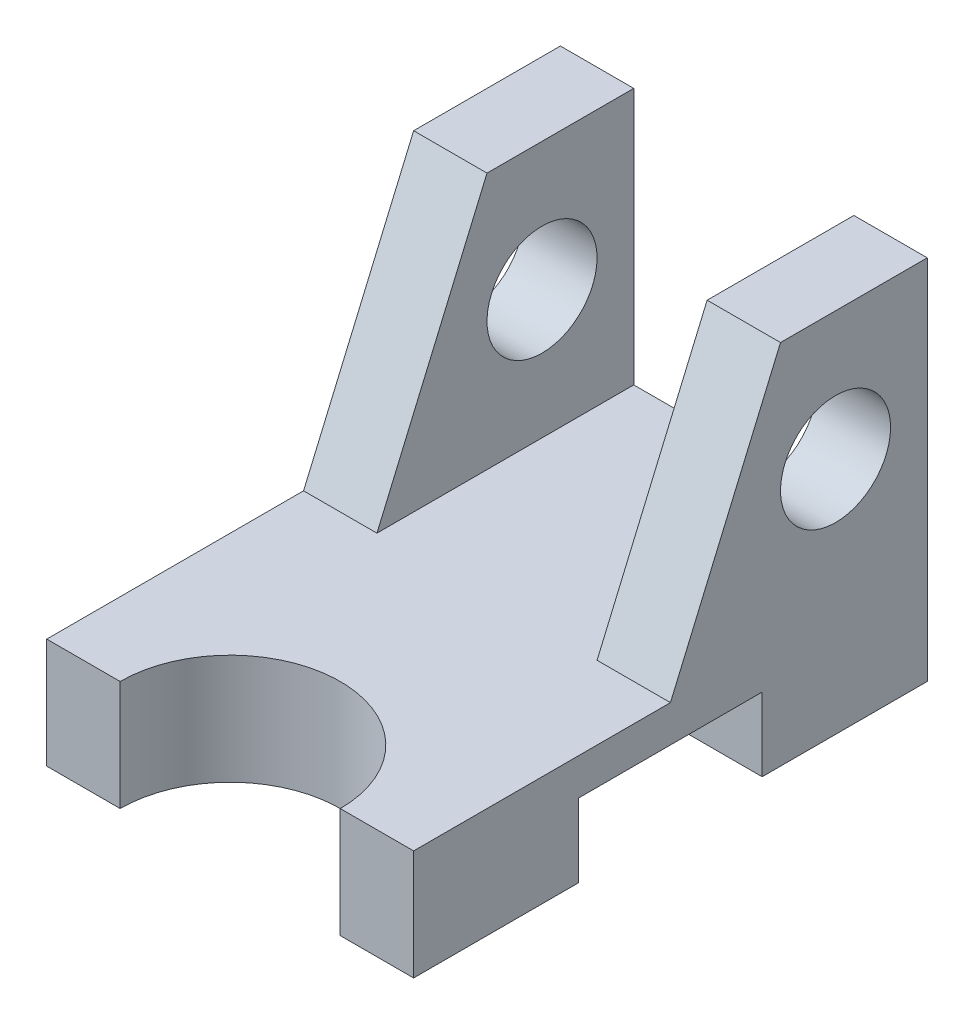
ISO-10303-21;
HEADER;
FILE_DESCRIPTION(('STEP AP214'),'2;1');
FILE_NAME('part.step','',(''),(''),'','','');
FILE_SCHEMA(('AUTOMOTIVE_DESIGN { 1 0 10303 214 1 1 1 1 }'));
ENDSEC;
DATA;
#1=APPLICATION_CONTEXT('core data for automotive mechanical design processes');
#2=APPLICATION_PROTOCOL_DEFINITION('international standard','automotive_design',2000,#1);
#3=PRODUCT_CONTEXT('',#1,'mechanical');
#4=PRODUCT('Part','Part','',(#3));
#5=PRODUCT_RELATED_PRODUCT_CATEGORY('part','',(#4));
#6=PRODUCT_DEFINITION_FORMATION('','',#4);
#7=PRODUCT_DEFINITION_CONTEXT('part definition',#1,'design');
#8=PRODUCT_DEFINITION('design','',#6,#7);
#9=PRODUCT_DEFINITION_SHAPE('','',#8);
#10=(LENGTH_UNIT() NAMED_UNIT(*) SI_UNIT(.MILLI.,.METRE.));
#11=(NAMED_UNIT(*) PLANE_ANGLE_UNIT() SI_UNIT($,.RADIAN.));
#12=(NAMED_UNIT(*) SI_UNIT($,.STERADIAN.) SOLID_ANGLE_UNIT());
#13=UNCERTAINTY_MEASURE_WITH_UNIT(LENGTH_MEASURE(1.E-05),#10,'distance_accuracy_value','');
#14=(GEOMETRIC_REPRESENTATION_CONTEXT(3) GLOBAL_UNCERTAINTY_ASSIGNED_CONTEXT((#13)) GLOBAL_UNIT_ASSIGNED_CONTEXT((#10,
#11,#12)) REPRESENTATION_CONTEXT('',''));
#15=CARTESIAN_POINT('',(0.,0.,0.));
#16=DIRECTION('',(0.,0.,1.));
#17=DIRECTION('',(1.,0.,0.));
#18=AXIS2_PLACEMENT_3D('',#15,#16,#17);
#19=CARTESIAN_POINT('',(-50.,100.,-30.));
#20=DIRECTION('',(0.,0.393919298579168,0.919145030018058));
#21=DIRECTION('',(0.,-0.919145030018058,0.393919298579168));
#22=AXIS2_PLACEMENT_3D('',#19,#20,#21);
#23=PLANE('',#22);
#24=DIRECTION('',(0.,0.919145030018058,-0.393919298579168));
#25=VECTOR('',#24,1.);
#26=CARTESIAN_POINT('',(30.,100.,-30.));
#27=LINE('',#26,#25);
#28=CARTESIAN_POINT('',(30.,30.,0.));
#29=VERTEX_POINT('',#28);
#30=CARTESIAN_POINT('',(30.,100.,-30.));
#31=VERTEX_POINT('',#30);
#32=EDGE_CURVE('E200',#29,#31,#27,.T.);
#33=ORIENTED_EDGE('',*,*,#32,.F.);
#34=DIRECTION('',(1.,0.,0.));
#35=VECTOR('',#34,1.);
#36=CARTESIAN_POINT('',(-50.,30.,0.));
#37=LINE('',#36,#35);
#38=CARTESIAN_POINT('',(50.,30.,0.));
#39=VERTEX_POINT('',#38);
#40=EDGE_CURVE('E305',#29,#39,#37,.T.);
#41=ORIENTED_EDGE('',*,*,#40,.T.);
#42=DIRECTION('',(0.,-0.919145030018058,0.393919298579168));
#43=VECTOR('',#42,1.);
#44=CARTESIAN_POINT('',(50.,100.,-30.));
#45=LINE('',#44,#43);
#46=CARTESIAN_POINT('',(50.,100.,-30.));
#47=VERTEX_POINT('',#46);
#48=EDGE_CURVE('E254',#47,#39,#45,.T.);
#49=ORIENTED_EDGE('',*,*,#48,.F.);
#50=DIRECTION('',(1.,0.,0.));
#51=VECTOR('',#50,1.);
#52=CARTESIAN_POINT('',(-50.,100.,-30.));
#53=LINE('',#52,#51);
#54=EDGE_CURVE('E310',#31,#47,#53,.T.);
#55=ORIENTED_EDGE('',*,*,#54,.F.);
#56=EDGE_LOOP('',(#33,#41,#49,#55));
#57=FACE_BOUND('',#56,.T.);
#58=ADVANCED_FACE('F45',(#57),#23,.T.);
#59=CARTESIAN_POINT('',(-50.,100.,-70.));
#60=DIRECTION('',(0.,1.,0.));
#61=DIRECTION('',(0.,0.,1.));
#62=AXIS2_PLACEMENT_3D('',#59,#60,#61);
#63=PLANE('',#62);
#64=DIRECTION('',(0.,0.,-1.));
#65=VECTOR('',#64,1.);
#66=CARTESIAN_POINT('',(30.,100.,70.));
#67=LINE('',#66,#65);
#68=CARTESIAN_POINT('',(30.,100.,-70.));
#69=VERTEX_POINT('',#68);
#70=EDGE_CURVE('E192',#31,#69,#67,.T.);
#71=ORIENTED_EDGE('',*,*,#70,.F.);
#72=ORIENTED_EDGE('',*,*,#54,.T.);
#73=DIRECTION('',(0.,0.,1.));
#74=VECTOR('',#73,1.);
#75=CARTESIAN_POINT('',(50.,100.,-70.));
#76=LINE('',#75,#74);
#77=CARTESIAN_POINT('',(50.,100.,-70.));
#78=VERTEX_POINT('',#77);
#79=EDGE_CURVE('E250',#78,#47,#76,.T.);
#80=ORIENTED_EDGE('',*,*,#79,.F.);
#81=DIRECTION('',(1.,0.,0.));
#82=VECTOR('',#81,1.);
#83=CARTESIAN_POINT('',(-50.,100.,-70.));
#84=LINE('',#83,#82);
#85=EDGE_CURVE('E313',#69,#78,#84,.T.);
#86=ORIENTED_EDGE('',*,*,#85,.F.);
#87=EDGE_LOOP('',(#71,#72,#80,#86));
#88=FACE_BOUND('',#87,.T.);
#89=ADVANCED_FACE('F346',(#88),#63,.T.);
#90=CARTESIAN_POINT('',(50.,65.,-45.));
#91=DIRECTION('',(1.,0.,0.));
#92=DIRECTION('',(0.,0.,-1.));
#93=AXIS2_PLACEMENT_3D('',#90,#91,#92);
#94=CYLINDRICAL_SURFACE('',#93,15.);
#95=CARTESIAN_POINT('',(30.,65.,-45.));
#96=DIRECTION('',(1.,0.,0.));
#97=DIRECTION('',(0.,1.,0.));
#98=AXIS2_PLACEMENT_3D('',#95,#96,#97);
#99=CIRCLE('',#98,15.);
#100=CARTESIAN_POINT('',(30.,80.,-45.));
#101=VERTEX_POINT('',#100);
#102=EDGE_CURVE('E49',#101,#101,#99,.F.);
#103=ORIENTED_EDGE('',*,*,#102,.T.);
#104=EDGE_LOOP('',(#103));
#105=FACE_BOUND('',#104,.T.);
#106=CARTESIAN_POINT('',(50.,65.,-45.));
#107=DIRECTION('',(1.,0.,0.));
#108=DIRECTION('',(0.,0.,-1.));
#109=AXIS2_PLACEMENT_3D('',#106,#107,#108);
#110=CIRCLE('',#109,15.);
#111=CARTESIAN_POINT('',(50.,65.,-60.));
#112=VERTEX_POINT('',#111);
#113=EDGE_CURVE('E203',#112,#112,#110,.T.);
#114=ORIENTED_EDGE('',*,*,#113,.T.);
#115=EDGE_LOOP('',(#114));
#116=FACE_BOUND('',#115,.T.);
#117=ADVANCED_FACE('F354',(#105,#116),#94,.F.);
#118=CARTESIAN_POINT('',(-50.,30.,70.));
#119=DIRECTION('',(0.,0.,1.));
#120=DIRECTION('',(1.,0.,0.));
#121=AXIS2_PLACEMENT_3D('',#118,#119,#120);
#122=PLANE('',#121);
#123=DIRECTION('',(0.,1.,0.));
#124=VECTOR('',#123,1.);
#125=CARTESIAN_POINT('',(30.,0.,70.));
#126=LINE('',#125,#124);
#127=CARTESIAN_POINT('',(30.,0.,70.));
#128=VERTEX_POINT('',#127);
#129=CARTESIAN_POINT('',(30.,30.,70.));
#130=VERTEX_POINT('',#129);
#131=EDGE_CURVE('E217',#128,#130,#126,.T.);
#132=ORIENTED_EDGE('',*,*,#131,.F.);
#133=DIRECTION('',(1.,0.,0.));
#134=VECTOR('',#133,1.);
#135=CARTESIAN_POINT('',(-50.,0.,70.));
#136=LINE('',#135,#134);
#137=CARTESIAN_POINT('',(50.,0.,70.));
#138=VERTEX_POINT('',#137);
#139=EDGE_CURVE('E300',#128,#138,#136,.T.);
#140=ORIENTED_EDGE('',*,*,#139,.T.);
#141=DIRECTION('',(0.,-1.,0.));
#142=VECTOR('',#141,1.);
#143=CARTESIAN_POINT('',(50.,30.,70.));
#144=LINE('',#143,#142);
#145=CARTESIAN_POINT('',(50.,30.,70.));
#146=VERTEX_POINT('',#145);
#147=EDGE_CURVE('E220',#146,#138,#144,.T.);
#148=ORIENTED_EDGE('',*,*,#147,.F.);
#149=DIRECTION('',(1.,0.,0.));
#150=VECTOR('',#149,1.);
#151=CARTESIAN_POINT('',(-50.,30.,70.));
#152=LINE('',#151,#150);
#153=EDGE_CURVE('E55',#130,#146,#152,.T.);
#154=ORIENTED_EDGE('',*,*,#153,.F.);
#155=EDGE_LOOP('',(#132,#140,#148,#154));
#156=FACE_BOUND('',#155,.T.);
#157=ADVANCED_FACE('F406',(#156),#122,.T.);
#158=DIRECTION('',(0.,1.,0.));
#159=VECTOR('',#158,1.);
#160=CARTESIAN_POINT('',(-30.,0.,70.));
#161=LINE('',#160,#159);
#162=CARTESIAN_POINT('',(-30.,0.,70.));
#163=VERTEX_POINT('',#162);
#164=CARTESIAN_POINT('',(-30.,30.,70.));
#165=VERTEX_POINT('',#164);
#166=EDGE_CURVE('E71',#163,#165,#161,.T.);
#167=ORIENTED_EDGE('',*,*,#166,.T.);
#168=CARTESIAN_POINT('',(-50.,30.,70.));
#169=VERTEX_POINT('',#168);
#170=EDGE_CURVE('E11',#169,#165,#152,.T.);
#171=ORIENTED_EDGE('',*,*,#170,.F.);
#172=DIRECTION('',(0.,-1.,0.));
#173=VECTOR('',#172,1.);
#174=CARTESIAN_POINT('',(-50.,30.,70.));
#175=LINE('',#174,#173);
#176=CARTESIAN_POINT('',(-50.,0.,70.));
#177=VERTEX_POINT('',#176);
#178=EDGE_CURVE('E262',#169,#177,#175,.T.);
#179=ORIENTED_EDGE('',*,*,#178,.T.);
#180=EDGE_CURVE('E329',#177,#163,#136,.T.);
#181=ORIENTED_EDGE('',*,*,#180,.T.);
#182=EDGE_LOOP('',(#167,#171,#179,#181));
#183=FACE_BOUND('',#182,.T.);
#184=ADVANCED_FACE('F47',(#183),#122,.T.);
#185=CARTESIAN_POINT('',(-50.,30.,0.));
#186=DIRECTION('',(0.,1.,0.));
#187=DIRECTION('',(0.,0.,1.));
#188=AXIS2_PLACEMENT_3D('',#185,#186,#187);
#189=PLANE('',#188);
#190=ORIENTED_EDGE('',*,*,#170,.T.);
#191=CARTESIAN_POINT('',(0.,30.,70.));
#192=DIRECTION('',(0.,1.,0.));
#193=DIRECTION('',(0.,0.,-1.));
#194=AXIS2_PLACEMENT_3D('',#191,#192,#193);
#195=CIRCLE('',#194,30.);
#196=EDGE_CURVE('E211',#130,#165,#195,.T.);
#197=ORIENTED_EDGE('',*,*,#196,.F.);
#198=ORIENTED_EDGE('',*,*,#153,.T.);
#199=DIRECTION('',(0.,0.,1.));
#200=VECTOR('',#199,1.);
#201=CARTESIAN_POINT('',(50.,30.,0.));
#202=LINE('',#201,#200);
#203=EDGE_CURVE('E258',#39,#146,#202,.T.);
#204=ORIENTED_EDGE('',*,*,#203,.F.);
#205=ORIENTED_EDGE('',*,*,#40,.F.);
#206=DIRECTION('',(0.,0.,-1.));
#207=VECTOR('',#206,1.);
#208=CARTESIAN_POINT('',(30.,30.,70.));
#209=LINE('',#208,#207);
#210=CARTESIAN_POINT('',(30.,30.,-70.));
#211=VERTEX_POINT('',#210);
#212=EDGE_CURVE('E173',#29,#211,#209,.T.);
#213=ORIENTED_EDGE('',*,*,#212,.T.);
#214=DIRECTION('',(-1.,0.,0.));
#215=VECTOR('',#214,1.);
#216=CARTESIAN_POINT('',(30.,30.,-70.));
#217=LINE('',#216,#215);
#218=CARTESIAN_POINT('',(-30.,30.,-70.));
#219=VERTEX_POINT('',#218);
#220=EDGE_CURVE('E176',#211,#219,#217,.T.);
#221=ORIENTED_EDGE('',*,*,#220,.T.);
#222=DIRECTION('',(0.,0.,-1.));
#223=VECTOR('',#222,1.);
#224=CARTESIAN_POINT('',(-30.,30.,70.));
#225=LINE('',#224,#223);
#226=CARTESIAN_POINT('',(-30.,30.,0.));
#227=VERTEX_POINT('',#226);
#228=EDGE_CURVE('E160',#227,#219,#225,.T.);
#229=ORIENTED_EDGE('',*,*,#228,.F.);
#230=CARTESIAN_POINT('',(-50.,30.,0.));
#231=VERTEX_POINT('',#230);
#232=EDGE_CURVE('E302',#231,#227,#37,.T.);
#233=ORIENTED_EDGE('',*,*,#232,.F.);
#234=DIRECTION('',(0.,0.,1.));
#235=VECTOR('',#234,1.);
#236=CARTESIAN_POINT('',(-50.,30.,0.));
#237=LINE('',#236,#235);
#238=EDGE_CURVE('E297',#231,#169,#237,.T.);
#239=ORIENTED_EDGE('',*,*,#238,.T.);
#240=EDGE_LOOP('',(#190,#197,#198,#204,#205,#213,#221,#229,#233,#239));
#241=FACE_BOUND('',#240,.T.);
#242=ADVANCED_FACE('F177',(#241),#189,.T.);
#243=DIRECTION('',(0.,-0.919145030018058,0.393919298579168));
#244=VECTOR('',#243,1.);
#245=CARTESIAN_POINT('',(-30.,100.,-30.));
#246=LINE('',#245,#244);
#247=CARTESIAN_POINT('',(-30.,100.,-30.));
#248=VERTEX_POINT('',#247);
#249=EDGE_CURVE('E168',#248,#227,#246,.T.);
#250=ORIENTED_EDGE('',*,*,#249,.F.);
#251=CARTESIAN_POINT('',(-50.,100.,-30.));
#252=VERTEX_POINT('',#251);
#253=EDGE_CURVE('E306',#252,#248,#53,.T.);
#254=ORIENTED_EDGE('',*,*,#253,.F.);
#255=DIRECTION('',(0.,-0.919145030018058,0.393919298579168));
#256=VECTOR('',#255,1.);
#257=CARTESIAN_POINT('',(-50.,100.,-30.));
#258=LINE('',#257,#256);
#259=EDGE_CURVE('E293',#252,#231,#258,.T.);
#260=ORIENTED_EDGE('',*,*,#259,.T.);
#261=ORIENTED_EDGE('',*,*,#232,.T.);
#262=EDGE_LOOP('',(#250,#254,#260,#261));
#263=FACE_BOUND('',#262,.T.);
#264=ADVANCED_FACE('F349',(#263),#23,.T.);
#265=DIRECTION('',(0.,0.,-1.));
#266=VECTOR('',#265,1.);
#267=CARTESIAN_POINT('',(-30.,100.,70.));
#268=LINE('',#267,#266);
#269=CARTESIAN_POINT('',(-30.,100.,-70.));
#270=VERTEX_POINT('',#269);
#271=EDGE_CURVE('E172',#248,#270,#268,.T.);
#272=ORIENTED_EDGE('',*,*,#271,.T.);
#273=CARTESIAN_POINT('',(-50.,100.,-70.));
#274=VERTEX_POINT('',#273);
#275=EDGE_CURVE('E185',#274,#270,#84,.T.);
#276=ORIENTED_EDGE('',*,*,#275,.F.);
#277=DIRECTION('',(0.,0.,1.));
#278=VECTOR('',#277,1.);
#279=CARTESIAN_POINT('',(-50.,100.,-70.));
#280=LINE('',#279,#278);
#281=EDGE_CURVE('E289',#274,#252,#280,.T.);
#282=ORIENTED_EDGE('',*,*,#281,.T.);
#283=ORIENTED_EDGE('',*,*,#253,.T.);
#284=EDGE_LOOP('',(#272,#276,#282,#283));
#285=FACE_BOUND('',#284,.T.);
#286=ADVANCED_FACE('F357',(#285),#63,.T.);
#287=CARTESIAN_POINT('',(-50.,0.,-70.));
#288=DIRECTION('',(0.,0.,-1.));
#289=DIRECTION('',(-1.,0.,0.));
#290=AXIS2_PLACEMENT_3D('',#287,#288,#289);
#291=PLANE('',#290);
#292=DIRECTION('',(0.,-1.,0.));
#293=VECTOR('',#292,1.);
#294=CARTESIAN_POINT('',(30.,100.,-70.));
#295=LINE('',#294,#293);
#296=EDGE_CURVE('E63',#69,#211,#295,.T.);
#297=ORIENTED_EDGE('',*,*,#296,.F.);
#298=ORIENTED_EDGE('',*,*,#85,.T.);
#299=DIRECTION('',(0.,1.,0.));
#300=VECTOR('',#299,1.);
#301=CARTESIAN_POINT('',(50.,0.,-70.));
#302=LINE('',#301,#300);
#303=CARTESIAN_POINT('',(50.,0.,-70.));
#304=VERTEX_POINT('',#303);
#305=EDGE_CURVE('E246',#304,#78,#302,.T.);
#306=ORIENTED_EDGE('',*,*,#305,.F.);
#307=DIRECTION('',(1.,0.,0.));
#308=VECTOR('',#307,1.);
#309=CARTESIAN_POINT('',(-50.,0.,-70.));
#310=LINE('',#309,#308);
#311=CARTESIAN_POINT('',(-50.,0.,-70.));
#312=VERTEX_POINT('',#311);
#313=EDGE_CURVE('E314',#312,#304,#310,.T.);
#314=ORIENTED_EDGE('',*,*,#313,.F.);
#315=DIRECTION('',(0.,1.,0.));
#316=VECTOR('',#315,1.);
#317=CARTESIAN_POINT('',(-50.,0.,-70.));
#318=LINE('',#317,#316);
#319=EDGE_CURVE('E286',#312,#274,#318,.T.);
#320=ORIENTED_EDGE('',*,*,#319,.T.);
#321=ORIENTED_EDGE('',*,*,#275,.T.);
#322=DIRECTION('',(0.,1.,0.));
#323=VECTOR('',#322,1.);
#324=CARTESIAN_POINT('',(-30.,100.,-70.));
#325=LINE('',#324,#323);
#326=EDGE_CURVE('E165',#219,#270,#325,.T.);
#327=ORIENTED_EDGE('',*,*,#326,.F.);
#328=ORIENTED_EDGE('',*,*,#220,.F.);
#329=EDGE_LOOP('',(#297,#298,#306,#314,#320,#321,#327,#328));
#330=FACE_BOUND('',#329,.T.);
#331=ADVANCED_FACE('F183',(#330),#291,.T.);
#332=CARTESIAN_POINT('',(-50.,0.,-25.));
#333=DIRECTION('',(0.,-1.,0.));
#334=DIRECTION('',(0.,0.,-1.));
#335=AXIS2_PLACEMENT_3D('',#332,#333,#334);
#336=PLANE('',#335);
#337=ORIENTED_EDGE('',*,*,#313,.T.);
#338=DIRECTION('',(0.,0.,-1.));
#339=VECTOR('',#338,1.);
#340=CARTESIAN_POINT('',(50.,0.,-25.));
#341=LINE('',#340,#339);
#342=CARTESIAN_POINT('',(50.,0.,-25.));
#343=VERTEX_POINT('',#342);
#344=EDGE_CURVE('E242',#343,#304,#341,.T.);
#345=ORIENTED_EDGE('',*,*,#344,.F.);
#346=DIRECTION('',(1.,0.,0.));
#347=VECTOR('',#346,1.);
#348=CARTESIAN_POINT('',(-50.,0.,-25.));
#349=LINE('',#348,#347);
#350=CARTESIAN_POINT('',(-50.,0.,-25.));
#351=VERTEX_POINT('',#350);
#352=EDGE_CURVE('E317',#351,#343,#349,.T.);
#353=ORIENTED_EDGE('',*,*,#352,.F.);
#354=DIRECTION('',(0.,0.,-1.));
#355=VECTOR('',#354,1.);
#356=CARTESIAN_POINT('',(-50.,0.,-25.));
#357=LINE('',#356,#355);
#358=EDGE_CURVE('E282',#351,#312,#357,.T.);
#359=ORIENTED_EDGE('',*,*,#358,.T.);
#360=EDGE_LOOP('',(#337,#345,#353,#359));
#361=FACE_BOUND('',#360,.T.);
#362=ADVANCED_FACE('F378',(#361),#336,.T.);
#363=CARTESIAN_POINT('',(-50.,20.,-25.));
#364=DIRECTION('',(0.,0.,1.));
#365=DIRECTION('',(0.,-1.,0.));
#366=AXIS2_PLACEMENT_3D('',#363,#364,#365);
#367=PLANE('',#366);
#368=ORIENTED_EDGE('',*,*,#352,.T.);
#369=DIRECTION('',(0.,-1.,0.));
#370=VECTOR('',#369,1.);
#371=CARTESIAN_POINT('',(50.,20.,-25.));
#372=LINE('',#371,#370);
#373=CARTESIAN_POINT('',(50.,20.,-25.));
#374=VERTEX_POINT('',#373);
#375=EDGE_CURVE('E238',#374,#343,#372,.T.);
#376=ORIENTED_EDGE('',*,*,#375,.F.);
#377=DIRECTION('',(1.,0.,0.));
#378=VECTOR('',#377,1.);
#379=CARTESIAN_POINT('',(-50.,20.,-25.));
#380=LINE('',#379,#378);
#381=CARTESIAN_POINT('',(-50.,20.,-25.));
#382=VERTEX_POINT('',#381);
#383=EDGE_CURVE('E320',#382,#374,#380,.T.);
#384=ORIENTED_EDGE('',*,*,#383,.F.);
#385=DIRECTION('',(0.,-1.,0.));
#386=VECTOR('',#385,1.);
#387=CARTESIAN_POINT('',(-50.,20.,-25.));
#388=LINE('',#387,#386);
#389=EDGE_CURVE('E278',#382,#351,#388,.T.);
#390=ORIENTED_EDGE('',*,*,#389,.T.);
#391=EDGE_LOOP('',(#368,#376,#384,#390));
#392=FACE_BOUND('',#391,.T.);
#393=ADVANCED_FACE('F385',(#392),#367,.T.);
#394=CARTESIAN_POINT('',(-50.,20.,25.));
#395=DIRECTION('',(0.,-1.,0.));
#396=DIRECTION('',(0.,0.,-1.));
#397=AXIS2_PLACEMENT_3D('',#394,#395,#396);
#398=PLANE('',#397);
#399=ORIENTED_EDGE('',*,*,#383,.T.);
#400=DIRECTION('',(0.,0.,-1.));
#401=VECTOR('',#400,1.);
#402=CARTESIAN_POINT('',(50.,20.,25.));
#403=LINE('',#402,#401);
#404=CARTESIAN_POINT('',(50.,20.,25.));
#405=VERTEX_POINT('',#404);
#406=EDGE_CURVE('E234',#405,#374,#403,.T.);
#407=ORIENTED_EDGE('',*,*,#406,.F.);
#408=DIRECTION('',(1.,0.,0.));
#409=VECTOR('',#408,1.);
#410=CARTESIAN_POINT('',(-50.,20.,25.));
#411=LINE('',#410,#409);
#412=CARTESIAN_POINT('',(-50.,20.,25.));
#413=VERTEX_POINT('',#412);
#414=EDGE_CURVE('E323',#413,#405,#411,.T.);
#415=ORIENTED_EDGE('',*,*,#414,.F.);
#416=DIRECTION('',(0.,0.,-1.));
#417=VECTOR('',#416,1.);
#418=CARTESIAN_POINT('',(-50.,20.,25.));
#419=LINE('',#418,#417);
#420=EDGE_CURVE('E274',#413,#382,#419,.T.);
#421=ORIENTED_EDGE('',*,*,#420,.T.);
#422=EDGE_LOOP('',(#399,#407,#415,#421));
#423=FACE_BOUND('',#422,.T.);
#424=ADVANCED_FACE('F390',(#423),#398,.T.);
#425=CARTESIAN_POINT('',(-50.,0.,25.));
#426=DIRECTION('',(0.,0.,-1.));
#427=DIRECTION('',(0.,1.,0.));
#428=AXIS2_PLACEMENT_3D('',#425,#426,#427);
#429=PLANE('',#428);
#430=ORIENTED_EDGE('',*,*,#414,.T.);
#431=DIRECTION('',(0.,1.,0.));
#432=VECTOR('',#431,1.);
#433=CARTESIAN_POINT('',(50.,0.,25.));
#434=LINE('',#433,#432);
#435=CARTESIAN_POINT('',(50.,0.,25.));
#436=VERTEX_POINT('',#435);
#437=EDGE_CURVE('E230',#436,#405,#434,.T.);
#438=ORIENTED_EDGE('',*,*,#437,.F.);
#439=DIRECTION('',(1.,0.,0.));
#440=VECTOR('',#439,1.);
#441=CARTESIAN_POINT('',(-50.,0.,25.));
#442=LINE('',#441,#440);
#443=CARTESIAN_POINT('',(-50.,0.,25.));
#444=VERTEX_POINT('',#443);
#445=EDGE_CURVE('E326',#444,#436,#442,.T.);
#446=ORIENTED_EDGE('',*,*,#445,.F.);
#447=DIRECTION('',(0.,1.,0.));
#448=VECTOR('',#447,1.);
#449=CARTESIAN_POINT('',(-50.,0.,25.));
#450=LINE('',#449,#448);
#451=EDGE_CURVE('E270',#444,#413,#450,.T.);
#452=ORIENTED_EDGE('',*,*,#451,.T.);
#453=EDGE_LOOP('',(#430,#438,#446,#452));
#454=FACE_BOUND('',#453,.T.);
#455=ADVANCED_FACE('F393',(#454),#429,.T.);
#456=CARTESIAN_POINT('',(-50.,0.,70.));
#457=DIRECTION('',(0.,-1.,0.));
#458=DIRECTION('',(0.,0.,-1.));
#459=AXIS2_PLACEMENT_3D('',#456,#457,#458);
#460=PLANE('',#459);
#461=CARTESIAN_POINT('',(0.,0.,70.));
#462=DIRECTION('',(0.,1.,0.));
#463=DIRECTION('',(0.,0.,-1.));
#464=AXIS2_PLACEMENT_3D('',#461,#462,#463);
#465=CIRCLE('',#464,30.);
#466=EDGE_CURVE('E212',#128,#163,#465,.T.);
#467=ORIENTED_EDGE('',*,*,#466,.T.);
#468=ORIENTED_EDGE('',*,*,#180,.F.);
#469=DIRECTION('',(0.,0.,-1.));
#470=VECTOR('',#469,1.);
#471=CARTESIAN_POINT('',(-50.,0.,70.));
#472=LINE('',#471,#470);
#473=EDGE_CURVE('E266',#177,#444,#472,.T.);
#474=ORIENTED_EDGE('',*,*,#473,.T.);
#475=ORIENTED_EDGE('',*,*,#445,.T.);
#476=DIRECTION('',(0.,0.,-1.));
#477=VECTOR('',#476,1.);
#478=CARTESIAN_POINT('',(50.,0.,70.));
#479=LINE('',#478,#477);
#480=EDGE_CURVE('E226',#138,#436,#479,.T.);
#481=ORIENTED_EDGE('',*,*,#480,.F.);
#482=ORIENTED_EDGE('',*,*,#139,.F.);
#483=EDGE_LOOP('',(#467,#468,#474,#475,#481,#482));
#484=FACE_BOUND('',#483,.T.);
#485=ADVANCED_FACE('F398',(#484),#460,.T.);
#486=CARTESIAN_POINT('',(-50.,0.,0.));
#487=DIRECTION('',(1.,0.,0.));
#488=DIRECTION('',(0.,0.,-1.));
#489=AXIS2_PLACEMENT_3D('',#486,#487,#488);
#490=PLANE('',#489);
#491=CARTESIAN_POINT('',(-50.,65.,-45.));
#492=DIRECTION('',(1.,0.,0.));
#493=DIRECTION('',(0.,0.,-1.));
#494=AXIS2_PLACEMENT_3D('',#491,#492,#493);
#495=CIRCLE('',#494,15.);
#496=CARTESIAN_POINT('',(-50.,65.,-60.));
#497=VERTEX_POINT('',#496);
#498=EDGE_CURVE('E207',#497,#497,#495,.T.);
#499=ORIENTED_EDGE('',*,*,#498,.T.);
#500=EDGE_LOOP('',(#499));
#501=FACE_BOUND('',#500,.T.);
#502=ORIENTED_EDGE('',*,*,#178,.F.);
#503=ORIENTED_EDGE('',*,*,#238,.F.);
#504=ORIENTED_EDGE('',*,*,#259,.F.);
#505=ORIENTED_EDGE('',*,*,#281,.F.);
#506=ORIENTED_EDGE('',*,*,#319,.F.);
#507=ORIENTED_EDGE('',*,*,#358,.F.);
#508=ORIENTED_EDGE('',*,*,#389,.F.);
#509=ORIENTED_EDGE('',*,*,#420,.F.);
#510=ORIENTED_EDGE('',*,*,#451,.F.);
#511=ORIENTED_EDGE('',*,*,#473,.F.);
#512=EDGE_LOOP('',(#502,#503,#504,#505,#506,#507,#508,#509,#510,#511));
#513=FACE_BOUND('',#512,.T.);
#514=ADVANCED_FACE('F372',(#501,#513),#490,.F.);
#515=CARTESIAN_POINT('',(50.,0.,0.));
#516=DIRECTION('',(1.,0.,0.));
#517=DIRECTION('',(0.,0.,-1.));
#518=AXIS2_PLACEMENT_3D('',#515,#516,#517);
#519=PLANE('',#518);
#520=ORIENTED_EDGE('',*,*,#113,.F.);
#521=EDGE_LOOP('',(#520));
#522=FACE_BOUND('',#521,.T.);
#523=ORIENTED_EDGE('',*,*,#147,.T.);
#524=ORIENTED_EDGE('',*,*,#480,.T.);
#525=ORIENTED_EDGE('',*,*,#437,.T.);
#526=ORIENTED_EDGE('',*,*,#406,.T.);
#527=ORIENTED_EDGE('',*,*,#375,.T.);
#528=ORIENTED_EDGE('',*,*,#344,.T.);
#529=ORIENTED_EDGE('',*,*,#305,.T.);
#530=ORIENTED_EDGE('',*,*,#79,.T.);
#531=ORIENTED_EDGE('',*,*,#48,.T.);
#532=ORIENTED_EDGE('',*,*,#203,.T.);
#533=EDGE_LOOP('',(#523,#524,#525,#526,#527,#528,#529,#530,#531,#532));
#534=FACE_BOUND('',#533,.T.);
#535=ADVANCED_FACE('F380',(#522,#534),#519,.T.);
#536=CARTESIAN_POINT('',(0.,0.,70.));
#537=DIRECTION('',(0.,1.,0.));
#538=DIRECTION('',(0.,0.,1.));
#539=AXIS2_PLACEMENT_3D('',#536,#537,#538);
#540=CYLINDRICAL_SURFACE('',#539,30.);
#541=ORIENTED_EDGE('',*,*,#196,.T.);
#542=ORIENTED_EDGE('',*,*,#166,.F.);
#543=ORIENTED_EDGE('',*,*,#466,.F.);
#544=ORIENTED_EDGE('',*,*,#131,.T.);
#545=EDGE_LOOP('',(#541,#542,#543,#544));
#546=FACE_BOUND('',#545,.T.);
#547=ADVANCED_FACE('F422',(#546),#540,.F.);
#548=CARTESIAN_POINT('',(-30.,65.,-45.));
#549=DIRECTION('',(-1.,0.,0.));
#550=DIRECTION('',(0.,-1.,0.));
#551=AXIS2_PLACEMENT_3D('',#548,#549,#550);
#552=CIRCLE('',#551,15.);
#553=CARTESIAN_POINT('',(-30.,50.,-45.));
#554=VERTEX_POINT('',#553);
#555=EDGE_CURVE('E195',#554,#554,#552,.F.);
#556=ORIENTED_EDGE('',*,*,#555,.T.);
#557=EDGE_LOOP('',(#556));
#558=FACE_BOUND('',#557,.T.);
#559=ORIENTED_EDGE('',*,*,#498,.F.);
#560=EDGE_LOOP('',(#559));
#561=FACE_BOUND('',#560,.T.);
#562=ADVANCED_FACE('F336',(#558,#561),#94,.F.);
#563=CARTESIAN_POINT('',(30.,100.,70.));
#564=DIRECTION('',(1.,0.,0.));
#565=DIRECTION('',(0.,1.,0.));
#566=AXIS2_PLACEMENT_3D('',#563,#564,#565);
#567=PLANE('',#566);
#568=ORIENTED_EDGE('',*,*,#32,.T.);
#569=ORIENTED_EDGE('',*,*,#70,.T.);
#570=ORIENTED_EDGE('',*,*,#296,.T.);
#571=ORIENTED_EDGE('',*,*,#212,.F.);
#572=EDGE_LOOP('',(#568,#569,#570,#571));
#573=FACE_BOUND('',#572,.T.);
#574=ORIENTED_EDGE('',*,*,#102,.F.);
#575=EDGE_LOOP('',(#574));
#576=FACE_BOUND('',#575,.T.);
#577=ADVANCED_FACE('F339',(#573,#576),#567,.F.);
#578=CARTESIAN_POINT('',(-30.,100.,70.));
#579=DIRECTION('',(-1.,0.,0.));
#580=DIRECTION('',(0.,-1.,0.));
#581=AXIS2_PLACEMENT_3D('',#578,#579,#580);
#582=PLANE('',#581);
#583=ORIENTED_EDGE('',*,*,#249,.T.);
#584=ORIENTED_EDGE('',*,*,#228,.T.);
#585=ORIENTED_EDGE('',*,*,#326,.T.);
#586=ORIENTED_EDGE('',*,*,#271,.F.);
#587=EDGE_LOOP('',(#583,#584,#585,#586));
#588=FACE_BOUND('',#587,.T.);
#589=ORIENTED_EDGE('',*,*,#555,.F.);
#590=EDGE_LOOP('',(#589));
#591=FACE_BOUND('',#590,.T.);
#592=ADVANCED_FACE('F162',(#588,#591),#582,.F.);
#593=CLOSED_SHELL('',(#58,#89,#117,#157,#184,#242,#264,#286,#331,#362,#393,#424,#455,#485,#514,
#535,#547,#562,#577,#592));
#594=MANIFOLD_SOLID_BREP('B2',#593);
#595=ADVANCED_BREP_SHAPE_REPRESENTATION('',(#18,#594),#14);
#596=SHAPE_DEFINITION_REPRESENTATION(#9,#595);
ENDSEC;
END-ISO-10303-21;
